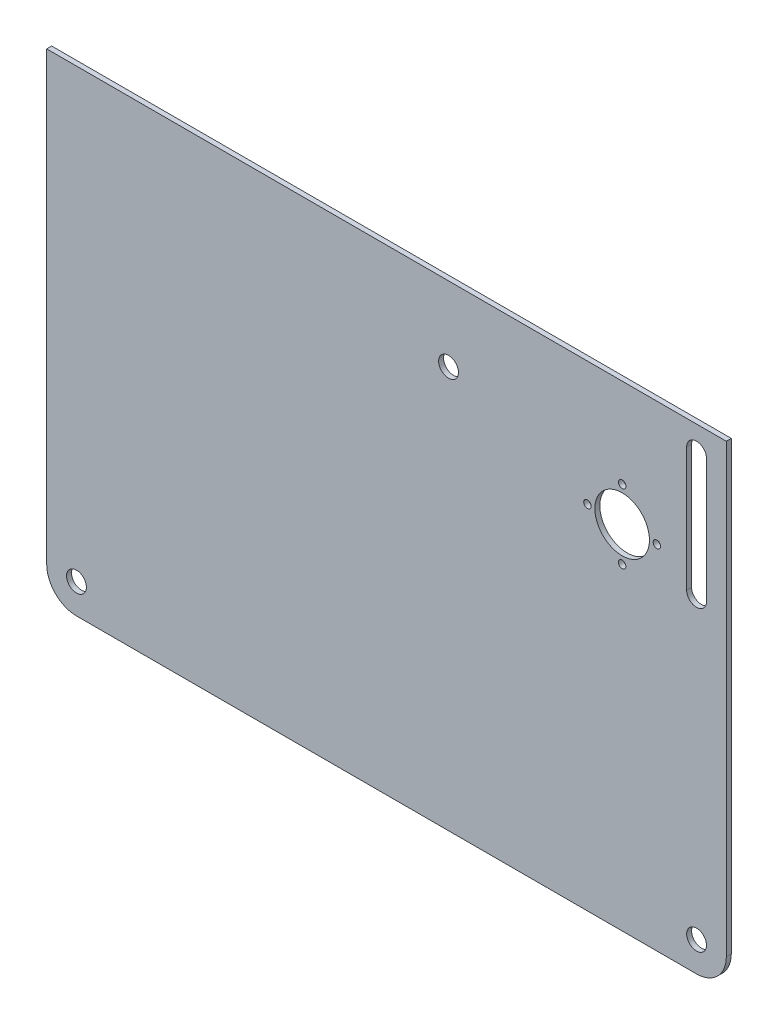
ISO-10303-21;
HEADER;
FILE_DESCRIPTION(('STEP AP214'),'2;1');
FILE_NAME('part.step','',(''),(''),'','','');
FILE_SCHEMA(('AUTOMOTIVE_DESIGN { 1 0 10303 214 1 1 1 1 }'));
ENDSEC;
DATA;
#1=APPLICATION_CONTEXT('core data for automotive mechanical design processes');
#2=APPLICATION_PROTOCOL_DEFINITION('international standard','automotive_design',2000,#1);
#3=PRODUCT_CONTEXT('',#1,'mechanical');
#4=PRODUCT('Part','Part','',(#3));
#5=PRODUCT_RELATED_PRODUCT_CATEGORY('part','',(#4));
#6=PRODUCT_DEFINITION_FORMATION('','',#4);
#7=PRODUCT_DEFINITION_CONTEXT('part definition',#1,'design');
#8=PRODUCT_DEFINITION('design','',#6,#7);
#9=PRODUCT_DEFINITION_SHAPE('','',#8);
#10=(LENGTH_UNIT() NAMED_UNIT(*) SI_UNIT(.MILLI.,.METRE.));
#11=(NAMED_UNIT(*) PLANE_ANGLE_UNIT() SI_UNIT($,.RADIAN.));
#12=(NAMED_UNIT(*) SI_UNIT($,.STERADIAN.) SOLID_ANGLE_UNIT());
#13=UNCERTAINTY_MEASURE_WITH_UNIT(LENGTH_MEASURE(1.E-05),#10,'distance_accuracy_value','');
#14=(GEOMETRIC_REPRESENTATION_CONTEXT(3) GLOBAL_UNCERTAINTY_ASSIGNED_CONTEXT((#13)) GLOBAL_UNIT_ASSIGNED_CONTEXT((#10,
#11,#12)) REPRESENTATION_CONTEXT('',''));
#15=CARTESIAN_POINT('',(0.,0.,0.));
#16=DIRECTION('',(0.,0.,1.));
#17=DIRECTION('',(1.,0.,0.));
#18=AXIS2_PLACEMENT_3D('',#15,#16,#17);
#19=CARTESIAN_POINT('',(0.,-12.,2.));
#20=DIRECTION('',(0.,1.,0.));
#21=DIRECTION('',(0.,0.,1.));
#22=AXIS2_PLACEMENT_3D('',#19,#20,#21);
#23=PLANE('',#22);
#24=DIRECTION('',(1.,0.,0.));
#25=VECTOR('',#24,1.);
#26=CARTESIAN_POINT('',(0.,-12.,0.));
#27=LINE('',#26,#25);
#28=CARTESIAN_POINT('',(-125.,-12.,0.));
#29=VERTEX_POINT('',#28);
#30=CARTESIAN_POINT('',(125.,-12.,0.));
#31=VERTEX_POINT('',#30);
#32=EDGE_CURVE('E212',#29,#31,#27,.T.);
#33=ORIENTED_EDGE('',*,*,#32,.T.);
#34=DIRECTION('',(0.,0.,-1.));
#35=VECTOR('',#34,1.);
#36=CARTESIAN_POINT('',(125.,-12.,2.));
#37=LINE('',#36,#35);
#38=CARTESIAN_POINT('',(125.,-12.,2.));
#39=VERTEX_POINT('',#38);
#40=EDGE_CURVE('E11',#39,#31,#37,.T.);
#41=ORIENTED_EDGE('',*,*,#40,.F.);
#42=DIRECTION('',(1.,0.,0.));
#43=VECTOR('',#42,1.);
#44=CARTESIAN_POINT('',(0.,-12.,2.));
#45=LINE('',#44,#43);
#46=CARTESIAN_POINT('',(-125.,-12.,2.));
#47=VERTEX_POINT('',#46);
#48=EDGE_CURVE('E349',#47,#39,#45,.T.);
#49=ORIENTED_EDGE('',*,*,#48,.F.);
#50=DIRECTION('',(0.,0.,-1.));
#51=VECTOR('',#50,1.);
#52=CARTESIAN_POINT('',(-125.,-12.,2.));
#53=LINE('',#52,#51);
#54=EDGE_CURVE('E65',#47,#29,#53,.T.);
#55=ORIENTED_EDGE('',*,*,#54,.T.);
#56=EDGE_LOOP('',(#33,#41,#49,#55));
#57=FACE_BOUND('',#56,.T.);
#58=ADVANCED_FACE('F45',(#57),#23,.F.);
#59=CARTESIAN_POINT('',(125.,0.,2.));
#60=DIRECTION('',(0.,0.,-1.));
#61=DIRECTION('',(-1.,0.,0.));
#62=AXIS2_PLACEMENT_3D('',#59,#60,#61);
#63=CYLINDRICAL_SURFACE('',#62,12.0000000000001);
#64=CARTESIAN_POINT('',(125.,0.,0.));
#65=DIRECTION('',(0.,0.,1.));
#66=DIRECTION('',(1.,0.,0.));
#67=AXIS2_PLACEMENT_3D('',#64,#65,#66);
#68=CIRCLE('',#67,12.0000000000001);
#69=CARTESIAN_POINT('',(137.,0.,0.));
#70=VERTEX_POINT('',#69);
#71=EDGE_CURVE('E215',#31,#70,#68,.T.);
#72=ORIENTED_EDGE('',*,*,#71,.T.);
#73=DIRECTION('',(0.,0.,-1.));
#74=VECTOR('',#73,1.);
#75=CARTESIAN_POINT('',(137.,0.,2.));
#76=LINE('',#75,#74);
#77=CARTESIAN_POINT('',(137.,0.,2.));
#78=VERTEX_POINT('',#77);
#79=EDGE_CURVE('E56',#78,#70,#76,.T.);
#80=ORIENTED_EDGE('',*,*,#79,.F.);
#81=CARTESIAN_POINT('',(125.,0.,2.));
#82=DIRECTION('',(0.,0.,1.));
#83=DIRECTION('',(1.,0.,0.));
#84=AXIS2_PLACEMENT_3D('',#81,#82,#83);
#85=CIRCLE('',#84,12.0000000000001);
#86=EDGE_CURVE('E352',#39,#78,#85,.T.);
#87=ORIENTED_EDGE('',*,*,#86,.F.);
#88=ORIENTED_EDGE('',*,*,#40,.T.);
#89=EDGE_LOOP('',(#72,#80,#87,#88));
#90=FACE_BOUND('',#89,.T.);
#91=ADVANCED_FACE('F279',(#90),#63,.T.);
#92=CARTESIAN_POINT('',(137.,0.,2.));
#93=DIRECTION('',(-1.,0.,0.));
#94=DIRECTION('',(0.,0.,1.));
#95=AXIS2_PLACEMENT_3D('',#92,#93,#94);
#96=PLANE('',#95);
#97=DIRECTION('',(0.,1.,0.));
#98=VECTOR('',#97,1.);
#99=CARTESIAN_POINT('',(137.,0.,0.));
#100=LINE('',#99,#98);
#101=CARTESIAN_POINT('',(137.,180.,0.));
#102=VERTEX_POINT('',#101);
#103=EDGE_CURVE('E218',#70,#102,#100,.T.);
#104=ORIENTED_EDGE('',*,*,#103,.T.);
#105=DIRECTION('',(0.,0.,-1.));
#106=VECTOR('',#105,1.);
#107=CARTESIAN_POINT('',(137.,180.,2.));
#108=LINE('',#107,#106);
#109=CARTESIAN_POINT('',(137.,180.,2.));
#110=VERTEX_POINT('',#109);
#111=EDGE_CURVE('E153',#110,#102,#108,.T.);
#112=ORIENTED_EDGE('',*,*,#111,.F.);
#113=DIRECTION('',(0.,1.,0.));
#114=VECTOR('',#113,1.);
#115=CARTESIAN_POINT('',(137.,0.,2.));
#116=LINE('',#115,#114);
#117=EDGE_CURVE('E139',#78,#110,#116,.T.);
#118=ORIENTED_EDGE('',*,*,#117,.F.);
#119=ORIENTED_EDGE('',*,*,#79,.T.);
#120=EDGE_LOOP('',(#104,#112,#118,#119));
#121=FACE_BOUND('',#120,.T.);
#122=ADVANCED_FACE('F284',(#121),#96,.F.);
#123=CARTESIAN_POINT('',(0.,180.,2.));
#124=DIRECTION('',(0.,-1.,0.));
#125=DIRECTION('',(1.,0.,0.));
#126=AXIS2_PLACEMENT_3D('',#123,#124,#125);
#127=PLANE('',#126);
#128=DIRECTION('',(-1.,0.,0.));
#129=VECTOR('',#128,1.);
#130=CARTESIAN_POINT('',(0.,180.,0.));
#131=LINE('',#130,#129);
#132=CARTESIAN_POINT('',(-137.,180.,0.));
#133=VERTEX_POINT('',#132);
#134=EDGE_CURVE('E149',#102,#133,#131,.T.);
#135=ORIENTED_EDGE('',*,*,#134,.T.);
#136=DIRECTION('',(0.,0.,-1.));
#137=VECTOR('',#136,1.);
#138=CARTESIAN_POINT('',(-137.,180.,2.));
#139=LINE('',#138,#137);
#140=CARTESIAN_POINT('',(-137.,180.,2.));
#141=VERTEX_POINT('',#140);
#142=EDGE_CURVE('E146',#141,#133,#139,.T.);
#143=ORIENTED_EDGE('',*,*,#142,.F.);
#144=DIRECTION('',(-1.,0.,0.));
#145=VECTOR('',#144,1.);
#146=CARTESIAN_POINT('',(0.,180.,2.));
#147=LINE('',#146,#145);
#148=EDGE_CURVE('E131',#110,#141,#147,.T.);
#149=ORIENTED_EDGE('',*,*,#148,.F.);
#150=ORIENTED_EDGE('',*,*,#111,.T.);
#151=EDGE_LOOP('',(#135,#143,#149,#150));
#152=FACE_BOUND('',#151,.T.);
#153=ADVANCED_FACE('F147',(#152),#127,.F.);
#154=CARTESIAN_POINT('',(-137.,0.,2.));
#155=DIRECTION('',(1.,0.,0.));
#156=DIRECTION('',(0.,1.,0.));
#157=AXIS2_PLACEMENT_3D('',#154,#155,#156);
#158=PLANE('',#157);
#159=DIRECTION('',(0.,-1.,0.));
#160=VECTOR('',#159,1.);
#161=CARTESIAN_POINT('',(-137.,0.,0.));
#162=LINE('',#161,#160);
#163=CARTESIAN_POINT('',(-137.,0.,0.));
#164=VERTEX_POINT('',#163);
#165=EDGE_CURVE('E223',#133,#164,#162,.T.);
#166=ORIENTED_EDGE('',*,*,#165,.T.);
#167=DIRECTION('',(0.,0.,-1.));
#168=VECTOR('',#167,1.);
#169=CARTESIAN_POINT('',(-137.,0.,2.));
#170=LINE('',#169,#168);
#171=CARTESIAN_POINT('',(-137.,0.,2.));
#172=VERTEX_POINT('',#171);
#173=EDGE_CURVE('E98',#172,#164,#170,.T.);
#174=ORIENTED_EDGE('',*,*,#173,.F.);
#175=DIRECTION('',(0.,-1.,0.));
#176=VECTOR('',#175,1.);
#177=CARTESIAN_POINT('',(-137.,0.,2.));
#178=LINE('',#177,#176);
#179=EDGE_CURVE('E137',#141,#172,#178,.T.);
#180=ORIENTED_EDGE('',*,*,#179,.F.);
#181=ORIENTED_EDGE('',*,*,#142,.T.);
#182=EDGE_LOOP('',(#166,#174,#180,#181));
#183=FACE_BOUND('',#182,.T.);
#184=ADVANCED_FACE('F155',(#183),#158,.F.);
#185=CARTESIAN_POINT('',(125.,120.,2.));
#186=DIRECTION('',(0.,0.,-1.));
#187=DIRECTION('',(-1.,0.,0.));
#188=AXIS2_PLACEMENT_3D('',#185,#186,#187);
#189=CYLINDRICAL_SURFACE('',#188,3.99999999999999);
#190=CARTESIAN_POINT('',(125.,120.,0.));
#191=DIRECTION('',(0.,0.,1.));
#192=DIRECTION('',(1.,0.,0.));
#193=AXIS2_PLACEMENT_3D('',#190,#191,#192);
#194=CIRCLE('',#193,3.99999999999999);
#195=CARTESIAN_POINT('',(121.,120.,0.));
#196=VERTEX_POINT('',#195);
#197=CARTESIAN_POINT('',(129.,120.,0.));
#198=VERTEX_POINT('',#197);
#199=EDGE_CURVE('E196',#196,#198,#194,.T.);
#200=ORIENTED_EDGE('',*,*,#199,.F.);
#201=DIRECTION('',(0.,0.,-1.));
#202=VECTOR('',#201,1.);
#203=CARTESIAN_POINT('',(121.,120.,2.));
#204=LINE('',#203,#202);
#205=CARTESIAN_POINT('',(121.,120.,2.));
#206=VERTEX_POINT('',#205);
#207=EDGE_CURVE('E49',#206,#196,#204,.T.);
#208=ORIENTED_EDGE('',*,*,#207,.F.);
#209=CARTESIAN_POINT('',(125.,120.,2.));
#210=DIRECTION('',(0.,0.,1.));
#211=DIRECTION('',(1.,0.,0.));
#212=AXIS2_PLACEMENT_3D('',#209,#210,#211);
#213=CIRCLE('',#212,3.99999999999999);
#214=CARTESIAN_POINT('',(129.,120.,2.));
#215=VERTEX_POINT('',#214);
#216=EDGE_CURVE('E261',#206,#215,#213,.T.);
#217=ORIENTED_EDGE('',*,*,#216,.T.);
#218=DIRECTION('',(0.,0.,-1.));
#219=VECTOR('',#218,1.);
#220=CARTESIAN_POINT('',(129.,120.,2.));
#221=LINE('',#220,#219);
#222=EDGE_CURVE('E160',#215,#198,#221,.T.);
#223=ORIENTED_EDGE('',*,*,#222,.T.);
#224=EDGE_LOOP('',(#200,#208,#217,#223));
#225=FACE_BOUND('',#224,.T.);
#226=ADVANCED_FACE('F260',(#225),#189,.F.);
#227=CARTESIAN_POINT('',(121.,0.,2.));
#228=DIRECTION('',(-1.,0.,0.));
#229=DIRECTION('',(0.,0.,1.));
#230=AXIS2_PLACEMENT_3D('',#227,#228,#229);
#231=PLANE('',#230);
#232=DIRECTION('',(0.,1.,0.));
#233=VECTOR('',#232,1.);
#234=CARTESIAN_POINT('',(121.,0.,0.));
#235=LINE('',#234,#233);
#236=CARTESIAN_POINT('',(121.,170.,0.));
#237=VERTEX_POINT('',#236);
#238=EDGE_CURVE('E200',#196,#237,#235,.T.);
#239=ORIENTED_EDGE('',*,*,#238,.T.);
#240=DIRECTION('',(0.,0.,-1.));
#241=VECTOR('',#240,1.);
#242=CARTESIAN_POINT('',(121.,170.,2.));
#243=LINE('',#242,#241);
#244=CARTESIAN_POINT('',(121.,170.,2.));
#245=VERTEX_POINT('',#244);
#246=EDGE_CURVE('E244',#245,#237,#243,.T.);
#247=ORIENTED_EDGE('',*,*,#246,.F.);
#248=DIRECTION('',(0.,1.,0.));
#249=VECTOR('',#248,1.);
#250=CARTESIAN_POINT('',(121.,0.,2.));
#251=LINE('',#250,#249);
#252=EDGE_CURVE('E254',#206,#245,#251,.T.);
#253=ORIENTED_EDGE('',*,*,#252,.F.);
#254=ORIENTED_EDGE('',*,*,#207,.T.);
#255=EDGE_LOOP('',(#239,#247,#253,#254));
#256=FACE_BOUND('',#255,.T.);
#257=ADVANCED_FACE('F253',(#256),#231,.F.);
#258=CARTESIAN_POINT('',(125.,170.,2.));
#259=DIRECTION('',(0.,0.,-1.));
#260=DIRECTION('',(-1.,0.,0.));
#261=AXIS2_PLACEMENT_3D('',#258,#259,#260);
#262=CYLINDRICAL_SURFACE('',#261,3.99999999999995);
#263=CARTESIAN_POINT('',(125.,170.,0.));
#264=DIRECTION('',(0.,0.,1.));
#265=DIRECTION('',(1.,0.,0.));
#266=AXIS2_PLACEMENT_3D('',#263,#264,#265);
#267=CIRCLE('',#266,3.99999999999995);
#268=CARTESIAN_POINT('',(129.,170.,0.));
#269=VERTEX_POINT('',#268);
#270=EDGE_CURVE('E204',#269,#237,#267,.T.);
#271=ORIENTED_EDGE('',*,*,#270,.F.);
#272=DIRECTION('',(0.,0.,-1.));
#273=VECTOR('',#272,1.);
#274=CARTESIAN_POINT('',(129.,170.,2.));
#275=LINE('',#274,#273);
#276=CARTESIAN_POINT('',(129.,170.,2.));
#277=VERTEX_POINT('',#276);
#278=EDGE_CURVE('E242',#277,#269,#275,.T.);
#279=ORIENTED_EDGE('',*,*,#278,.F.);
#280=CARTESIAN_POINT('',(125.,170.,2.));
#281=DIRECTION('',(0.,0.,1.));
#282=DIRECTION('',(1.,0.,0.));
#283=AXIS2_PLACEMENT_3D('',#280,#281,#282);
#284=CIRCLE('',#283,3.99999999999995);
#285=EDGE_CURVE('E340',#277,#245,#284,.T.);
#286=ORIENTED_EDGE('',*,*,#285,.T.);
#287=ORIENTED_EDGE('',*,*,#246,.T.);
#288=EDGE_LOOP('',(#271,#279,#286,#287));
#289=FACE_BOUND('',#288,.T.);
#290=ADVANCED_FACE('F268',(#289),#262,.F.);
#291=CARTESIAN_POINT('',(129.,0.,2.));
#292=DIRECTION('',(-1.,0.,0.));
#293=DIRECTION('',(0.,-1.,0.));
#294=AXIS2_PLACEMENT_3D('',#291,#292,#293);
#295=PLANE('',#294);
#296=DIRECTION('',(0.,1.,0.));
#297=VECTOR('',#296,1.);
#298=CARTESIAN_POINT('',(129.,0.,0.));
#299=LINE('',#298,#297);
#300=EDGE_CURVE('E208',#198,#269,#299,.T.);
#301=ORIENTED_EDGE('',*,*,#300,.F.);
#302=ORIENTED_EDGE('',*,*,#222,.F.);
#303=DIRECTION('',(0.,1.,0.));
#304=VECTOR('',#303,1.);
#305=CARTESIAN_POINT('',(129.,0.,2.));
#306=LINE('',#305,#304);
#307=EDGE_CURVE('E266',#215,#277,#306,.T.);
#308=ORIENTED_EDGE('',*,*,#307,.T.);
#309=ORIENTED_EDGE('',*,*,#278,.T.);
#310=EDGE_LOOP('',(#301,#302,#308,#309));
#311=FACE_BOUND('',#310,.T.);
#312=ADVANCED_FACE('F265',(#311),#295,.T.);
#313=CARTESIAN_POINT('',(25.,150.,2.));
#314=DIRECTION('',(0.,0.,-1.));
#315=DIRECTION('',(-1.,0.,0.));
#316=AXIS2_PLACEMENT_3D('',#313,#314,#315);
#317=CYLINDRICAL_SURFACE('',#316,4.00000000000001);
#318=CARTESIAN_POINT('',(25.,150.,2.));
#319=DIRECTION('',(0.,0.,1.));
#320=DIRECTION('',(1.,0.,0.));
#321=AXIS2_PLACEMENT_3D('',#318,#319,#320);
#322=CIRCLE('',#321,4.00000000000001);
#323=CARTESIAN_POINT('',(29.,150.,2.));
#324=VERTEX_POINT('',#323);
#325=EDGE_CURVE('E335',#324,#324,#322,.T.);
#326=ORIENTED_EDGE('',*,*,#325,.T.);
#327=EDGE_LOOP('',(#326));
#328=FACE_BOUND('',#327,.T.);
#329=CARTESIAN_POINT('',(25.,150.,0.));
#330=DIRECTION('',(0.,0.,1.));
#331=DIRECTION('',(1.,0.,0.));
#332=AXIS2_PLACEMENT_3D('',#329,#330,#331);
#333=CIRCLE('',#332,4.00000000000001);
#334=CARTESIAN_POINT('',(29.,150.,0.));
#335=VERTEX_POINT('',#334);
#336=EDGE_CURVE('E192',#335,#335,#333,.T.);
#337=ORIENTED_EDGE('',*,*,#336,.F.);
#338=EDGE_LOOP('',(#337));
#339=FACE_BOUND('',#338,.T.);
#340=ADVANCED_FACE('F275',(#328,#339),#317,.F.);
#341=CARTESIAN_POINT('',(95.,130.,2.));
#342=DIRECTION('',(0.,0.,-1.));
#343=DIRECTION('',(-1.,0.,0.));
#344=AXIS2_PLACEMENT_3D('',#341,#342,#343);
#345=CYLINDRICAL_SURFACE('',#344,11.);
#346=CARTESIAN_POINT('',(95.,130.,2.));
#347=DIRECTION('',(0.,0.,1.));
#348=DIRECTION('',(1.,0.,0.));
#349=AXIS2_PLACEMENT_3D('',#346,#347,#348);
#350=CIRCLE('',#349,11.);
#351=CARTESIAN_POINT('',(106.,130.,2.));
#352=VERTEX_POINT('',#351);
#353=EDGE_CURVE('E331',#352,#352,#350,.T.);
#354=ORIENTED_EDGE('',*,*,#353,.T.);
#355=EDGE_LOOP('',(#354));
#356=FACE_BOUND('',#355,.T.);
#357=CARTESIAN_POINT('',(95.,130.,0.));
#358=DIRECTION('',(0.,0.,1.));
#359=DIRECTION('',(1.,0.,0.));
#360=AXIS2_PLACEMENT_3D('',#357,#358,#359);
#361=CIRCLE('',#360,11.);
#362=CARTESIAN_POINT('',(106.,130.,0.));
#363=VERTEX_POINT('',#362);
#364=EDGE_CURVE('E188',#363,#363,#361,.T.);
#365=ORIENTED_EDGE('',*,*,#364,.F.);
#366=EDGE_LOOP('',(#365));
#367=FACE_BOUND('',#366,.T.);
#368=ADVANCED_FACE('F392',(#356,#367),#345,.F.);
#369=CARTESIAN_POINT('',(125.,0.,2.));
#370=DIRECTION('',(0.,0.,-1.));
#371=DIRECTION('',(-1.,0.,0.));
#372=AXIS2_PLACEMENT_3D('',#369,#370,#371);
#373=CYLINDRICAL_SURFACE('',#372,3.99999999999999);
#374=CARTESIAN_POINT('',(125.,0.,2.));
#375=DIRECTION('',(0.,0.,1.));
#376=DIRECTION('',(1.,0.,0.));
#377=AXIS2_PLACEMENT_3D('',#374,#375,#376);
#378=CIRCLE('',#377,3.99999999999999);
#379=CARTESIAN_POINT('',(129.,0.,2.));
#380=VERTEX_POINT('',#379);
#381=EDGE_CURVE('E327',#380,#380,#378,.T.);
#382=ORIENTED_EDGE('',*,*,#381,.T.);
#383=EDGE_LOOP('',(#382));
#384=FACE_BOUND('',#383,.T.);
#385=CARTESIAN_POINT('',(125.,0.,0.));
#386=DIRECTION('',(0.,0.,1.));
#387=DIRECTION('',(1.,0.,0.));
#388=AXIS2_PLACEMENT_3D('',#385,#386,#387);
#389=CIRCLE('',#388,3.99999999999999);
#390=CARTESIAN_POINT('',(129.,0.,0.));
#391=VERTEX_POINT('',#390);
#392=EDGE_CURVE('E184',#391,#391,#389,.T.);
#393=ORIENTED_EDGE('',*,*,#392,.F.);
#394=EDGE_LOOP('',(#393));
#395=FACE_BOUND('',#394,.T.);
#396=ADVANCED_FACE('F398',(#384,#395),#373,.F.);
#397=CARTESIAN_POINT('',(-125.,0.,2.));
#398=DIRECTION('',(0.,0.,-1.));
#399=DIRECTION('',(-1.,0.,0.));
#400=AXIS2_PLACEMENT_3D('',#397,#398,#399);
#401=CYLINDRICAL_SURFACE('',#400,4.00000000000001);
#402=CARTESIAN_POINT('',(-125.,0.,2.));
#403=DIRECTION('',(0.,0.,1.));
#404=DIRECTION('',(1.,0.,0.));
#405=AXIS2_PLACEMENT_3D('',#402,#403,#404);
#406=CIRCLE('',#405,4.00000000000001);
#407=CARTESIAN_POINT('',(-121.,0.,2.));
#408=VERTEX_POINT('',#407);
#409=EDGE_CURVE('E323',#408,#408,#406,.T.);
#410=ORIENTED_EDGE('',*,*,#409,.T.);
#411=EDGE_LOOP('',(#410));
#412=FACE_BOUND('',#411,.T.);
#413=CARTESIAN_POINT('',(-125.,0.,0.));
#414=DIRECTION('',(0.,0.,1.));
#415=DIRECTION('',(1.,0.,0.));
#416=AXIS2_PLACEMENT_3D('',#413,#414,#415);
#417=CIRCLE('',#416,4.00000000000001);
#418=CARTESIAN_POINT('',(-121.,0.,0.));
#419=VERTEX_POINT('',#418);
#420=EDGE_CURVE('E180',#419,#419,#417,.T.);
#421=ORIENTED_EDGE('',*,*,#420,.F.);
#422=EDGE_LOOP('',(#421));
#423=FACE_BOUND('',#422,.T.);
#424=ADVANCED_FACE('F405',(#412,#423),#401,.F.);
#425=CARTESIAN_POINT('',(95.,144.,2.));
#426=DIRECTION('',(0.,0.,-1.));
#427=DIRECTION('',(-1.,0.,0.));
#428=AXIS2_PLACEMENT_3D('',#425,#426,#427);
#429=CYLINDRICAL_SURFACE('',#428,1.5);
#430=CARTESIAN_POINT('',(95.,144.,2.));
#431=DIRECTION('',(0.,0.,1.));
#432=DIRECTION('',(1.,0.,0.));
#433=AXIS2_PLACEMENT_3D('',#430,#431,#432);
#434=CIRCLE('',#433,1.5);
#435=CARTESIAN_POINT('',(96.5,144.,2.));
#436=VERTEX_POINT('',#435);
#437=EDGE_CURVE('E319',#436,#436,#434,.T.);
#438=ORIENTED_EDGE('',*,*,#437,.T.);
#439=EDGE_LOOP('',(#438));
#440=FACE_BOUND('',#439,.T.);
#441=CARTESIAN_POINT('',(95.,144.,0.));
#442=DIRECTION('',(0.,0.,1.));
#443=DIRECTION('',(1.,0.,0.));
#444=AXIS2_PLACEMENT_3D('',#441,#442,#443);
#445=CIRCLE('',#444,1.5);
#446=CARTESIAN_POINT('',(96.5,144.,0.));
#447=VERTEX_POINT('',#446);
#448=EDGE_CURVE('E176',#447,#447,#445,.T.);
#449=ORIENTED_EDGE('',*,*,#448,.F.);
#450=EDGE_LOOP('',(#449));
#451=FACE_BOUND('',#450,.T.);
#452=ADVANCED_FACE('F409',(#440,#451),#429,.F.);
#453=CARTESIAN_POINT('',(109.,130.,2.));
#454=DIRECTION('',(0.,0.,-1.));
#455=DIRECTION('',(-1.,0.,0.));
#456=AXIS2_PLACEMENT_3D('',#453,#454,#455);
#457=CYLINDRICAL_SURFACE('',#456,1.49999999999998);
#458=CARTESIAN_POINT('',(109.,130.,2.));
#459=DIRECTION('',(0.,0.,1.));
#460=DIRECTION('',(1.,0.,0.));
#461=AXIS2_PLACEMENT_3D('',#458,#459,#460);
#462=CIRCLE('',#461,1.49999999999998);
#463=CARTESIAN_POINT('',(110.5,130.,2.));
#464=VERTEX_POINT('',#463);
#465=EDGE_CURVE('E315',#464,#464,#462,.T.);
#466=ORIENTED_EDGE('',*,*,#465,.T.);
#467=EDGE_LOOP('',(#466));
#468=FACE_BOUND('',#467,.T.);
#469=CARTESIAN_POINT('',(109.,130.,0.));
#470=DIRECTION('',(0.,0.,1.));
#471=DIRECTION('',(1.,0.,0.));
#472=AXIS2_PLACEMENT_3D('',#469,#470,#471);
#473=CIRCLE('',#472,1.49999999999998);
#474=CARTESIAN_POINT('',(110.5,130.,0.));
#475=VERTEX_POINT('',#474);
#476=EDGE_CURVE('E172',#475,#475,#473,.T.);
#477=ORIENTED_EDGE('',*,*,#476,.F.);
#478=EDGE_LOOP('',(#477));
#479=FACE_BOUND('',#478,.T.);
#480=ADVANCED_FACE('F413',(#468,#479),#457,.F.);
#481=CARTESIAN_POINT('',(95.,116.,2.));
#482=DIRECTION('',(0.,0.,-1.));
#483=DIRECTION('',(-1.,0.,0.));
#484=AXIS2_PLACEMENT_3D('',#481,#482,#483);
#485=CYLINDRICAL_SURFACE('',#484,1.50000000000001);
#486=CARTESIAN_POINT('',(95.,116.,2.));
#487=DIRECTION('',(0.,0.,1.));
#488=DIRECTION('',(1.,0.,0.));
#489=AXIS2_PLACEMENT_3D('',#486,#487,#488);
#490=CIRCLE('',#489,1.50000000000001);
#491=CARTESIAN_POINT('',(96.5,116.,2.));
#492=VERTEX_POINT('',#491);
#493=EDGE_CURVE('E311',#492,#492,#490,.T.);
#494=ORIENTED_EDGE('',*,*,#493,.T.);
#495=EDGE_LOOP('',(#494));
#496=FACE_BOUND('',#495,.T.);
#497=CARTESIAN_POINT('',(95.,116.,0.));
#498=DIRECTION('',(0.,0.,1.));
#499=DIRECTION('',(1.,0.,0.));
#500=AXIS2_PLACEMENT_3D('',#497,#498,#499);
#501=CIRCLE('',#500,1.50000000000001);
#502=CARTESIAN_POINT('',(96.5,116.,0.));
#503=VERTEX_POINT('',#502);
#504=EDGE_CURVE('E168',#503,#503,#501,.T.);
#505=ORIENTED_EDGE('',*,*,#504,.F.);
#506=EDGE_LOOP('',(#505));
#507=FACE_BOUND('',#506,.T.);
#508=ADVANCED_FACE('F374',(#496,#507),#485,.F.);
#509=CARTESIAN_POINT('',(81.,130.,2.));
#510=DIRECTION('',(0.,0.,-1.));
#511=DIRECTION('',(-1.,0.,0.));
#512=AXIS2_PLACEMENT_3D('',#509,#510,#511);
#513=CYLINDRICAL_SURFACE('',#512,1.49999999999999);
#514=CARTESIAN_POINT('',(81.,130.,2.));
#515=DIRECTION('',(0.,0.,1.));
#516=DIRECTION('',(1.,0.,0.));
#517=AXIS2_PLACEMENT_3D('',#514,#515,#516);
#518=CIRCLE('',#517,1.49999999999999);
#519=CARTESIAN_POINT('',(82.5,130.,2.));
#520=VERTEX_POINT('',#519);
#521=EDGE_CURVE('E230',#520,#520,#518,.T.);
#522=ORIENTED_EDGE('',*,*,#521,.T.);
#523=EDGE_LOOP('',(#522));
#524=FACE_BOUND('',#523,.T.);
#525=CARTESIAN_POINT('',(81.,130.,0.));
#526=DIRECTION('',(0.,0.,1.));
#527=DIRECTION('',(1.,0.,0.));
#528=AXIS2_PLACEMENT_3D('',#525,#526,#527);
#529=CIRCLE('',#528,1.49999999999999);
#530=CARTESIAN_POINT('',(82.5,130.,0.));
#531=VERTEX_POINT('',#530);
#532=EDGE_CURVE('E164',#531,#531,#529,.T.);
#533=ORIENTED_EDGE('',*,*,#532,.F.);
#534=EDGE_LOOP('',(#533));
#535=FACE_BOUND('',#534,.T.);
#536=ADVANCED_FACE('F47',(#524,#535),#513,.F.);
#537=CARTESIAN_POINT('',(-125.,0.,2.));
#538=DIRECTION('',(0.,0.,-1.));
#539=DIRECTION('',(-1.,0.,0.));
#540=AXIS2_PLACEMENT_3D('',#537,#538,#539);
#541=CYLINDRICAL_SURFACE('',#540,12.);
#542=CARTESIAN_POINT('',(-125.,0.,0.));
#543=DIRECTION('',(0.,0.,1.));
#544=DIRECTION('',(1.,0.,0.));
#545=AXIS2_PLACEMENT_3D('',#542,#543,#544);
#546=CIRCLE('',#545,12.);
#547=EDGE_CURVE('E226',#29,#164,#546,.F.);
#548=ORIENTED_EDGE('',*,*,#547,.F.);
#549=ORIENTED_EDGE('',*,*,#54,.F.);
#550=CARTESIAN_POINT('',(-125.,0.,2.));
#551=DIRECTION('',(0.,0.,1.));
#552=DIRECTION('',(1.,0.,0.));
#553=AXIS2_PLACEMENT_3D('',#550,#551,#552);
#554=CIRCLE('',#553,12.);
#555=EDGE_CURVE('E157',#47,#172,#554,.F.);
#556=ORIENTED_EDGE('',*,*,#555,.T.);
#557=ORIENTED_EDGE('',*,*,#173,.T.);
#558=EDGE_LOOP('',(#548,#549,#556,#557));
#559=FACE_BOUND('',#558,.T.);
#560=ADVANCED_FACE('F295',(#559),#541,.T.);
#561=CARTESIAN_POINT('',(0.,0.,2.));
#562=DIRECTION('',(0.,0.,1.));
#563=DIRECTION('',(1.,0.,0.));
#564=AXIS2_PLACEMENT_3D('',#561,#562,#563);
#565=PLANE('',#564);
#566=ORIENTED_EDGE('',*,*,#521,.F.);
#567=EDGE_LOOP('',(#566));
#568=FACE_BOUND('',#567,.T.);
#569=ORIENTED_EDGE('',*,*,#493,.F.);
#570=EDGE_LOOP('',(#569));
#571=FACE_BOUND('',#570,.T.);
#572=ORIENTED_EDGE('',*,*,#465,.F.);
#573=EDGE_LOOP('',(#572));
#574=FACE_BOUND('',#573,.T.);
#575=ORIENTED_EDGE('',*,*,#437,.F.);
#576=EDGE_LOOP('',(#575));
#577=FACE_BOUND('',#576,.T.);
#578=ORIENTED_EDGE('',*,*,#409,.F.);
#579=EDGE_LOOP('',(#578));
#580=FACE_BOUND('',#579,.T.);
#581=ORIENTED_EDGE('',*,*,#381,.F.);
#582=EDGE_LOOP('',(#581));
#583=FACE_BOUND('',#582,.T.);
#584=ORIENTED_EDGE('',*,*,#353,.F.);
#585=EDGE_LOOP('',(#584));
#586=FACE_BOUND('',#585,.T.);
#587=ORIENTED_EDGE('',*,*,#325,.F.);
#588=EDGE_LOOP('',(#587));
#589=FACE_BOUND('',#588,.T.);
#590=ORIENTED_EDGE('',*,*,#216,.F.);
#591=ORIENTED_EDGE('',*,*,#252,.T.);
#592=ORIENTED_EDGE('',*,*,#285,.F.);
#593=ORIENTED_EDGE('',*,*,#307,.F.);
#594=EDGE_LOOP('',(#590,#591,#592,#593));
#595=FACE_BOUND('',#594,.T.);
#596=ORIENTED_EDGE('',*,*,#48,.T.);
#597=ORIENTED_EDGE('',*,*,#86,.T.);
#598=ORIENTED_EDGE('',*,*,#117,.T.);
#599=ORIENTED_EDGE('',*,*,#148,.T.);
#600=ORIENTED_EDGE('',*,*,#179,.T.);
#601=ORIENTED_EDGE('',*,*,#555,.F.);
#602=EDGE_LOOP('',(#596,#597,#598,#599,#600,#601));
#603=FACE_BOUND('',#602,.T.);
#604=ADVANCED_FACE('F134',(#568,#571,#574,#577,#580,#583,#586,#589,#595,#603),#565,.T.);
#605=CARTESIAN_POINT('',(0.,0.,0.));
#606=DIRECTION('',(0.,0.,1.));
#607=DIRECTION('',(1.,0.,0.));
#608=AXIS2_PLACEMENT_3D('',#605,#606,#607);
#609=PLANE('',#608);
#610=ORIENTED_EDGE('',*,*,#532,.T.);
#611=EDGE_LOOP('',(#610));
#612=FACE_BOUND('',#611,.T.);
#613=ORIENTED_EDGE('',*,*,#504,.T.);
#614=EDGE_LOOP('',(#613));
#615=FACE_BOUND('',#614,.T.);
#616=ORIENTED_EDGE('',*,*,#476,.T.);
#617=EDGE_LOOP('',(#616));
#618=FACE_BOUND('',#617,.T.);
#619=ORIENTED_EDGE('',*,*,#448,.T.);
#620=EDGE_LOOP('',(#619));
#621=FACE_BOUND('',#620,.T.);
#622=ORIENTED_EDGE('',*,*,#420,.T.);
#623=EDGE_LOOP('',(#622));
#624=FACE_BOUND('',#623,.T.);
#625=ORIENTED_EDGE('',*,*,#392,.T.);
#626=EDGE_LOOP('',(#625));
#627=FACE_BOUND('',#626,.T.);
#628=ORIENTED_EDGE('',*,*,#364,.T.);
#629=EDGE_LOOP('',(#628));
#630=FACE_BOUND('',#629,.T.);
#631=ORIENTED_EDGE('',*,*,#336,.T.);
#632=EDGE_LOOP('',(#631));
#633=FACE_BOUND('',#632,.T.);
#634=ORIENTED_EDGE('',*,*,#199,.T.);
#635=ORIENTED_EDGE('',*,*,#300,.T.);
#636=ORIENTED_EDGE('',*,*,#270,.T.);
#637=ORIENTED_EDGE('',*,*,#238,.F.);
#638=EDGE_LOOP('',(#634,#635,#636,#637));
#639=FACE_BOUND('',#638,.T.);
#640=ORIENTED_EDGE('',*,*,#32,.F.);
#641=ORIENTED_EDGE('',*,*,#547,.T.);
#642=ORIENTED_EDGE('',*,*,#165,.F.);
#643=ORIENTED_EDGE('',*,*,#134,.F.);
#644=ORIENTED_EDGE('',*,*,#103,.F.);
#645=ORIENTED_EDGE('',*,*,#71,.F.);
#646=EDGE_LOOP('',(#640,#641,#642,#643,#644,#645));
#647=FACE_BOUND('',#646,.T.);
#648=ADVANCED_FACE('F257',(#612,#615,#618,#621,#624,#627,#630,#633,#639,#647),#609,.F.);
#649=CLOSED_SHELL('',(#58,#91,#122,#153,#184,#226,#257,#290,#312,#340,#368,#396,#424,#452,#480,
#508,#536,#560,#604,#648));
#650=MANIFOLD_SOLID_BREP('B2',#649);
#651=ADVANCED_BREP_SHAPE_REPRESENTATION('',(#18,#650),#14);
#652=SHAPE_DEFINITION_REPRESENTATION(#9,#651);
ENDSEC;
END-ISO-10303-21;
